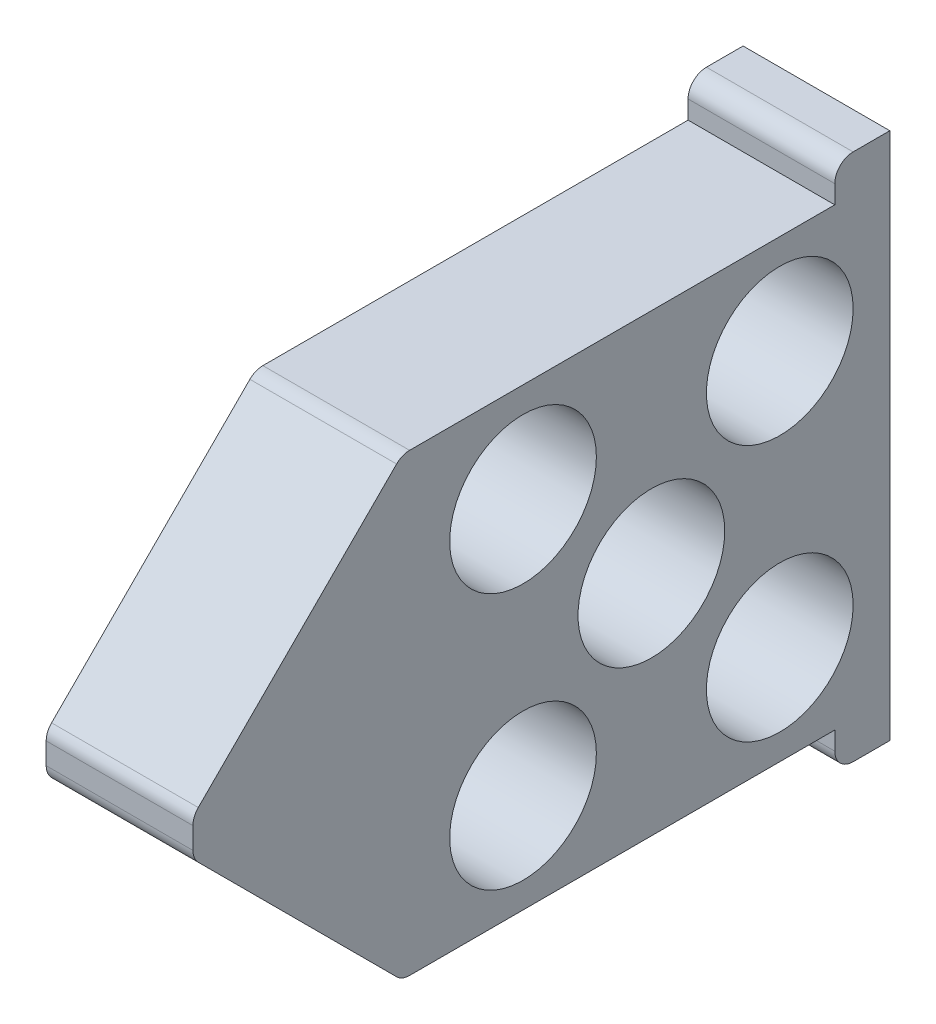
ISO-10303-21;
HEADER;
FILE_DESCRIPTION(('STEP AP214'),'2;1');
FILE_NAME('part.step','',(''),(''),'','','');
FILE_SCHEMA(('AUTOMOTIVE_DESIGN { 1 0 10303 214 1 1 1 1 }'));
ENDSEC;
DATA;
#1=APPLICATION_CONTEXT('core data for automotive mechanical design processes');
#2=APPLICATION_PROTOCOL_DEFINITION('international standard','automotive_design',2000,#1);
#3=PRODUCT_CONTEXT('',#1,'mechanical');
#4=PRODUCT('Part','Part','',(#3));
#5=PRODUCT_RELATED_PRODUCT_CATEGORY('part','',(#4));
#6=PRODUCT_DEFINITION_FORMATION('','',#4);
#7=PRODUCT_DEFINITION_CONTEXT('part definition',#1,'design');
#8=PRODUCT_DEFINITION('design','',#6,#7);
#9=PRODUCT_DEFINITION_SHAPE('','',#8);
#10=(LENGTH_UNIT() NAMED_UNIT(*) SI_UNIT(.MILLI.,.METRE.));
#11=(NAMED_UNIT(*) PLANE_ANGLE_UNIT() SI_UNIT($,.RADIAN.));
#12=(NAMED_UNIT(*) SI_UNIT($,.STERADIAN.) SOLID_ANGLE_UNIT());
#13=UNCERTAINTY_MEASURE_WITH_UNIT(LENGTH_MEASURE(1.E-05),#10,'distance_accuracy_value','');
#14=(GEOMETRIC_REPRESENTATION_CONTEXT(3) GLOBAL_UNCERTAINTY_ASSIGNED_CONTEXT((#13)) GLOBAL_UNIT_ASSIGNED_CONTEXT((#10,
#11,#12)) REPRESENTATION_CONTEXT('',''));
#15=CARTESIAN_POINT('',(0.,0.,0.));
#16=DIRECTION('',(0.,0.,1.));
#17=DIRECTION('',(1.,0.,0.));
#18=AXIS2_PLACEMENT_3D('',#15,#16,#17);
#19=CARTESIAN_POINT('',(4.,-6.20000000000003,-6.));
#20=DIRECTION('',(0.,1.,0.));
#21=DIRECTION('',(0.,0.,1.));
#22=AXIS2_PLACEMENT_3D('',#19,#20,#21);
#23=PLANE('',#22);
#24=DIRECTION('',(0.,0.,-1.));
#25=VECTOR('',#24,1.);
#26=CARTESIAN_POINT('',(4.,-6.20000000000003,-6.));
#27=LINE('',#26,#25);
#28=CARTESIAN_POINT('',(4.,-6.20000000000003,5.59289321881345));
#29=VERTEX_POINT('',#28);
#30=CARTESIAN_POINT('',(4.,-6.20000000000003,-6.));
#31=VERTEX_POINT('',#30);
#32=EDGE_CURVE('E150',#29,#31,#27,.T.);
#33=ORIENTED_EDGE('',*,*,#32,.F.);
#34=DIRECTION('',(-1.,0.,0.));
#35=VECTOR('',#34,1.);
#36=CARTESIAN_POINT('',(4.,-6.20000000000003,5.59289321881345));
#37=LINE('',#36,#35);
#38=CARTESIAN_POINT('',(0.,-6.20000000000003,5.59289321881345));
#39=VERTEX_POINT('',#38);
#40=EDGE_CURVE('E176',#29,#39,#37,.T.);
#41=ORIENTED_EDGE('',*,*,#40,.T.);
#42=DIRECTION('',(0.,0.,-1.));
#43=VECTOR('',#42,1.);
#44=CARTESIAN_POINT('',(0.,-6.20000000000003,-6.));
#45=LINE('',#44,#43);
#46=CARTESIAN_POINT('',(0.,-6.20000000000003,-6.));
#47=VERTEX_POINT('',#46);
#48=EDGE_CURVE('E174',#39,#47,#45,.T.);
#49=ORIENTED_EDGE('',*,*,#48,.T.);
#50=DIRECTION('',(-1.,0.,0.));
#51=VECTOR('',#50,1.);
#52=CARTESIAN_POINT('',(4.,-6.20000000000003,-6.));
#53=LINE('',#52,#51);
#54=EDGE_CURVE('E168',#31,#47,#53,.T.);
#55=ORIENTED_EDGE('',*,*,#54,.F.);
#56=EDGE_LOOP('',(#33,#41,#49,#55));
#57=FACE_BOUND('',#56,.T.);
#58=ADVANCED_FACE('F36',(#57),#23,.F.);
#59=CARTESIAN_POINT('',(4.,-6.20000000000003,-6.));
#60=DIRECTION('',(0.,0.,-1.));
#61=DIRECTION('',(0.,1.,0.));
#62=AXIS2_PLACEMENT_3D('',#59,#60,#61);
#63=PLANE('',#62);
#64=DIRECTION('',(0.,-1.,0.));
#65=VECTOR('',#64,1.);
#66=CARTESIAN_POINT('',(0.,-6.20000000000003,-6.));
#67=LINE('',#66,#65);
#68=CARTESIAN_POINT('',(0.,-6.70000000000003,-6.));
#69=VERTEX_POINT('',#68);
#70=EDGE_CURVE('E275',#47,#69,#67,.T.);
#71=ORIENTED_EDGE('',*,*,#70,.T.);
#72=DIRECTION('',(-1.,0.,0.));
#73=VECTOR('',#72,1.);
#74=CARTESIAN_POINT('',(4.,-6.70000000000003,-6.));
#75=LINE('',#74,#73);
#76=CARTESIAN_POINT('',(4.,-6.70000000000003,-6.));
#77=VERTEX_POINT('',#76);
#78=EDGE_CURVE('E170',#69,#77,#75,.F.);
#79=ORIENTED_EDGE('',*,*,#78,.T.);
#80=DIRECTION('',(0.,-1.,0.));
#81=VECTOR('',#80,1.);
#82=CARTESIAN_POINT('',(4.,-6.20000000000003,-6.));
#83=LINE('',#82,#81);
#84=EDGE_CURVE('E154',#31,#77,#83,.T.);
#85=ORIENTED_EDGE('',*,*,#84,.F.);
#86=ORIENTED_EDGE('',*,*,#54,.T.);
#87=EDGE_LOOP('',(#71,#79,#85,#86));
#88=FACE_BOUND('',#87,.T.);
#89=ADVANCED_FACE('F167',(#88),#63,.F.);
#90=CARTESIAN_POINT('',(4.,-7.20000000000003,-6.));
#91=DIRECTION('',(0.,1.,0.));
#92=DIRECTION('',(0.,0.,1.));
#93=AXIS2_PLACEMENT_3D('',#90,#91,#92);
#94=PLANE('',#93);
#95=DIRECTION('',(0.,0.,-1.));
#96=VECTOR('',#95,1.);
#97=CARTESIAN_POINT('',(4.,-7.20000000000003,-6.));
#98=LINE('',#97,#96);
#99=CARTESIAN_POINT('',(4.,-7.20000000000003,-6.5));
#100=VERTEX_POINT('',#99);
#101=CARTESIAN_POINT('',(4.,-7.20000000000003,-7.5));
#102=VERTEX_POINT('',#101);
#103=EDGE_CURVE('E171',#100,#102,#98,.T.);
#104=ORIENTED_EDGE('',*,*,#103,.F.);
#105=DIRECTION('',(-1.,0.,0.));
#106=VECTOR('',#105,1.);
#107=CARTESIAN_POINT('',(4.,-7.20000000000003,-6.5));
#108=LINE('',#107,#106);
#109=CARTESIAN_POINT('',(0.,-7.20000000000003,-6.5));
#110=VERTEX_POINT('',#109);
#111=EDGE_CURVE('E223',#100,#110,#108,.T.);
#112=ORIENTED_EDGE('',*,*,#111,.T.);
#113=DIRECTION('',(0.,0.,-1.));
#114=VECTOR('',#113,1.);
#115=CARTESIAN_POINT('',(0.,-7.20000000000003,-6.));
#116=LINE('',#115,#114);
#117=CARTESIAN_POINT('',(0.,-7.20000000000003,-7.5));
#118=VERTEX_POINT('',#117);
#119=EDGE_CURVE('E274',#110,#118,#116,.T.);
#120=ORIENTED_EDGE('',*,*,#119,.T.);
#121=DIRECTION('',(-1.,0.,0.));
#122=VECTOR('',#121,1.);
#123=CARTESIAN_POINT('',(4.,-7.20000000000003,-7.5));
#124=LINE('',#123,#122);
#125=EDGE_CURVE('E177',#102,#118,#124,.T.);
#126=ORIENTED_EDGE('',*,*,#125,.F.);
#127=EDGE_LOOP('',(#104,#112,#120,#126));
#128=FACE_BOUND('',#127,.T.);
#129=ADVANCED_FACE('F360',(#128),#94,.F.);
#130=CARTESIAN_POINT('',(4.,7.20000000000003,-7.5));
#131=DIRECTION('',(0.,0.,1.));
#132=DIRECTION('',(1.,0.,0.));
#133=AXIS2_PLACEMENT_3D('',#130,#131,#132);
#134=PLANE('',#133);
#135=DIRECTION('',(0.,1.,0.));
#136=VECTOR('',#135,1.);
#137=CARTESIAN_POINT('',(0.,7.20000000000003,-7.5));
#138=LINE('',#137,#136);
#139=CARTESIAN_POINT('',(0.,7.20000000000003,-7.5));
#140=VERTEX_POINT('',#139);
#141=EDGE_CURVE('E250',#118,#140,#138,.T.);
#142=ORIENTED_EDGE('',*,*,#141,.T.);
#143=DIRECTION('',(-1.,0.,0.));
#144=VECTOR('',#143,1.);
#145=CARTESIAN_POINT('',(4.,7.20000000000003,-7.5));
#146=LINE('',#145,#144);
#147=CARTESIAN_POINT('',(4.,7.20000000000003,-7.5));
#148=VERTEX_POINT('',#147);
#149=EDGE_CURVE('E182',#148,#140,#146,.T.);
#150=ORIENTED_EDGE('',*,*,#149,.F.);
#151=DIRECTION('',(0.,1.,0.));
#152=VECTOR('',#151,1.);
#153=CARTESIAN_POINT('',(4.,7.20000000000003,-7.5));
#154=LINE('',#153,#152);
#155=EDGE_CURVE('E291',#102,#148,#154,.T.);
#156=ORIENTED_EDGE('',*,*,#155,.F.);
#157=ORIENTED_EDGE('',*,*,#125,.T.);
#158=EDGE_LOOP('',(#142,#150,#156,#157));
#159=FACE_BOUND('',#158,.T.);
#160=ADVANCED_FACE('F384',(#159),#134,.F.);
#161=CARTESIAN_POINT('',(4.,7.20000000000003,-6.));
#162=DIRECTION('',(0.,-1.,0.));
#163=DIRECTION('',(0.,0.,-1.));
#164=AXIS2_PLACEMENT_3D('',#161,#162,#163);
#165=PLANE('',#164);
#166=DIRECTION('',(0.,0.,1.));
#167=VECTOR('',#166,1.);
#168=CARTESIAN_POINT('',(0.,7.20000000000003,-6.));
#169=LINE('',#168,#167);
#170=CARTESIAN_POINT('',(0.,7.20000000000003,-6.5));
#171=VERTEX_POINT('',#170);
#172=EDGE_CURVE('E246',#140,#171,#169,.T.);
#173=ORIENTED_EDGE('',*,*,#172,.T.);
#174=DIRECTION('',(-1.,0.,0.));
#175=VECTOR('',#174,1.);
#176=CARTESIAN_POINT('',(4.,7.20000000000003,-6.5));
#177=LINE('',#176,#175);
#178=CARTESIAN_POINT('',(4.,7.20000000000003,-6.5));
#179=VERTEX_POINT('',#178);
#180=EDGE_CURVE('E11',#171,#179,#177,.F.);
#181=ORIENTED_EDGE('',*,*,#180,.T.);
#182=DIRECTION('',(0.,0.,1.));
#183=VECTOR('',#182,1.);
#184=CARTESIAN_POINT('',(4.,7.20000000000003,-6.));
#185=LINE('',#184,#183);
#186=EDGE_CURVE('E269',#148,#179,#185,.T.);
#187=ORIENTED_EDGE('',*,*,#186,.F.);
#188=ORIENTED_EDGE('',*,*,#149,.T.);
#189=EDGE_LOOP('',(#173,#181,#187,#188));
#190=FACE_BOUND('',#189,.T.);
#191=ADVANCED_FACE('F266',(#190),#165,.F.);
#192=CARTESIAN_POINT('',(4.,6.20000000000003,-6.));
#193=DIRECTION('',(0.,0.,-1.));
#194=DIRECTION('',(0.,1.,0.));
#195=AXIS2_PLACEMENT_3D('',#192,#193,#194);
#196=PLANE('',#195);
#197=DIRECTION('',(0.,-1.,0.));
#198=VECTOR('',#197,1.);
#199=CARTESIAN_POINT('',(4.,6.20000000000003,-6.));
#200=LINE('',#199,#198);
#201=CARTESIAN_POINT('',(4.,6.70000000000003,-6.));
#202=VERTEX_POINT('',#201);
#203=CARTESIAN_POINT('',(4.,6.20000000000003,-6.));
#204=VERTEX_POINT('',#203);
#205=EDGE_CURVE('E236',#202,#204,#200,.T.);
#206=ORIENTED_EDGE('',*,*,#205,.F.);
#207=DIRECTION('',(-1.,0.,0.));
#208=VECTOR('',#207,1.);
#209=CARTESIAN_POINT('',(4.,6.70000000000003,-6.));
#210=LINE('',#209,#208);
#211=CARTESIAN_POINT('',(0.,6.70000000000003,-6.));
#212=VERTEX_POINT('',#211);
#213=EDGE_CURVE('E45',#202,#212,#210,.T.);
#214=ORIENTED_EDGE('',*,*,#213,.T.);
#215=DIRECTION('',(0.,-1.,0.));
#216=VECTOR('',#215,1.);
#217=CARTESIAN_POINT('',(0.,6.20000000000003,-6.));
#218=LINE('',#217,#216);
#219=CARTESIAN_POINT('',(0.,6.20000000000003,-6.));
#220=VERTEX_POINT('',#219);
#221=EDGE_CURVE('E234',#212,#220,#218,.T.);
#222=ORIENTED_EDGE('',*,*,#221,.T.);
#223=DIRECTION('',(-1.,0.,0.));
#224=VECTOR('',#223,1.);
#225=CARTESIAN_POINT('',(4.,6.20000000000003,-6.));
#226=LINE('',#225,#224);
#227=EDGE_CURVE('E260',#204,#220,#226,.T.);
#228=ORIENTED_EDGE('',*,*,#227,.F.);
#229=EDGE_LOOP('',(#206,#214,#222,#228));
#230=FACE_BOUND('',#229,.T.);
#231=ADVANCED_FACE('F232',(#230),#196,.F.);
#232=CARTESIAN_POINT('',(4.,6.20000000000003,-6.));
#233=DIRECTION('',(0.,-1.,0.));
#234=DIRECTION('',(0.,0.,-1.));
#235=AXIS2_PLACEMENT_3D('',#232,#233,#234);
#236=PLANE('',#235);
#237=DIRECTION('',(0.,0.,1.));
#238=VECTOR('',#237,1.);
#239=CARTESIAN_POINT('',(0.,6.20000000000003,-6.));
#240=LINE('',#239,#238);
#241=CARTESIAN_POINT('',(0.,6.20000000000003,5.59289321881345));
#242=VERTEX_POINT('',#241);
#243=EDGE_CURVE('E245',#220,#242,#240,.T.);
#244=ORIENTED_EDGE('',*,*,#243,.T.);
#245=DIRECTION('',(-1.,0.,0.));
#246=VECTOR('',#245,1.);
#247=CARTESIAN_POINT('',(4.,6.20000000000003,5.59289321881345));
#248=LINE('',#247,#246);
#249=CARTESIAN_POINT('',(4.,6.20000000000003,5.59289321881345));
#250=VERTEX_POINT('',#249);
#251=EDGE_CURVE('E221',#242,#250,#248,.F.);
#252=ORIENTED_EDGE('',*,*,#251,.T.);
#253=DIRECTION('',(0.,0.,1.));
#254=VECTOR('',#253,1.);
#255=CARTESIAN_POINT('',(4.,6.20000000000003,-6.));
#256=LINE('',#255,#254);
#257=EDGE_CURVE('E286',#204,#250,#256,.T.);
#258=ORIENTED_EDGE('',*,*,#257,.F.);
#259=ORIENTED_EDGE('',*,*,#227,.T.);
#260=EDGE_LOOP('',(#244,#252,#258,#259));
#261=FACE_BOUND('',#260,.T.);
#262=ADVANCED_FACE('F388',(#261),#236,.F.);
#263=CARTESIAN_POINT('',(4.,6.20000000000003,5.8));
#264=DIRECTION('',(0.,-0.707106781186546,-0.707106781186549));
#265=DIRECTION('',(0.,0.707106781186549,-0.707106781186546));
#266=AXIS2_PLACEMENT_3D('',#263,#264,#265);
#267=PLANE('',#266);
#268=DIRECTION('',(0.,-0.707106781186549,0.707106781186546));
#269=VECTOR('',#268,1.);
#270=CARTESIAN_POINT('',(0.,6.20000000000003,5.8));
#271=LINE('',#270,#269);
#272=CARTESIAN_POINT('',(0.,6.0535533905933,5.94644660940673));
#273=VERTEX_POINT('',#272);
#274=CARTESIAN_POINT('',(0.,0.646446609406727,11.3535533905933));
#275=VERTEX_POINT('',#274);
#276=EDGE_CURVE('E248',#273,#275,#271,.T.);
#277=ORIENTED_EDGE('',*,*,#276,.T.);
#278=DIRECTION('',(-1.,0.,0.));
#279=VECTOR('',#278,1.);
#280=CARTESIAN_POINT('',(4.,0.646446609406727,11.3535533905933));
#281=LINE('',#280,#279);
#282=CARTESIAN_POINT('',(4.,0.646446609406727,11.3535533905933));
#283=VERTEX_POINT('',#282);
#284=EDGE_CURVE('E219',#275,#283,#281,.F.);
#285=ORIENTED_EDGE('',*,*,#284,.T.);
#286=DIRECTION('',(0.,-0.707106781186549,0.707106781186546));
#287=VECTOR('',#286,1.);
#288=CARTESIAN_POINT('',(4.,6.20000000000003,5.8));
#289=LINE('',#288,#287);
#290=CARTESIAN_POINT('',(4.,6.0535533905933,5.94644660940673));
#291=VERTEX_POINT('',#290);
#292=EDGE_CURVE('E284',#291,#283,#289,.T.);
#293=ORIENTED_EDGE('',*,*,#292,.F.);
#294=DIRECTION('',(-1.,0.,0.));
#295=VECTOR('',#294,1.);
#296=CARTESIAN_POINT('',(4.,6.0535533905933,5.94644660940673));
#297=LINE('',#296,#295);
#298=EDGE_CURVE('E216',#291,#273,#297,.T.);
#299=ORIENTED_EDGE('',*,*,#298,.T.);
#300=EDGE_LOOP('',(#277,#285,#293,#299));
#301=FACE_BOUND('',#300,.T.);
#302=ADVANCED_FACE('F393',(#301),#267,.F.);
#303=CARTESIAN_POINT('',(4.,0.5,11.5));
#304=DIRECTION('',(0.,0.,-1.));
#305=DIRECTION('',(-1.,0.,0.));
#306=AXIS2_PLACEMENT_3D('',#303,#304,#305);
#307=PLANE('',#306);
#308=DIRECTION('',(0.,-1.,0.));
#309=VECTOR('',#308,1.);
#310=CARTESIAN_POINT('',(0.,0.5,11.5));
#311=LINE('',#310,#309);
#312=CARTESIAN_POINT('',(0.,0.292893218813454,11.5));
#313=VERTEX_POINT('',#312);
#314=CARTESIAN_POINT('',(0.,-0.292893218813454,11.5));
#315=VERTEX_POINT('',#314);
#316=EDGE_CURVE('E256',#313,#315,#311,.T.);
#317=ORIENTED_EDGE('',*,*,#316,.T.);
#318=DIRECTION('',(-1.,0.,0.));
#319=VECTOR('',#318,1.);
#320=CARTESIAN_POINT('',(4.,-0.292893218813454,11.5));
#321=LINE('',#320,#319);
#322=CARTESIAN_POINT('',(4.,-0.292893218813454,11.5));
#323=VERTEX_POINT('',#322);
#324=EDGE_CURVE('E52',#315,#323,#321,.F.);
#325=ORIENTED_EDGE('',*,*,#324,.T.);
#326=DIRECTION('',(0.,-1.,0.));
#327=VECTOR('',#326,1.);
#328=CARTESIAN_POINT('',(4.,0.5,11.5));
#329=LINE('',#328,#327);
#330=CARTESIAN_POINT('',(4.,0.292893218813454,11.5));
#331=VERTEX_POINT('',#330);
#332=EDGE_CURVE('E282',#331,#323,#329,.T.);
#333=ORIENTED_EDGE('',*,*,#332,.F.);
#334=DIRECTION('',(-1.,0.,0.));
#335=VECTOR('',#334,1.);
#336=CARTESIAN_POINT('',(4.,0.292893218813454,11.5));
#337=LINE('',#336,#335);
#338=EDGE_CURVE('E212',#331,#313,#337,.T.);
#339=ORIENTED_EDGE('',*,*,#338,.T.);
#340=EDGE_LOOP('',(#317,#325,#333,#339));
#341=FACE_BOUND('',#340,.T.);
#342=ADVANCED_FACE('F398',(#341),#307,.F.);
#343=CARTESIAN_POINT('',(4.,-6.20000000000003,5.8));
#344=DIRECTION('',(0.,0.707106781186546,-0.707106781186549));
#345=DIRECTION('',(0.,0.707106781186549,0.707106781186546));
#346=AXIS2_PLACEMENT_3D('',#343,#344,#345);
#347=PLANE('',#346);
#348=DIRECTION('',(0.,-0.707106781186549,-0.707106781186546));
#349=VECTOR('',#348,1.);
#350=CARTESIAN_POINT('',(0.,-6.20000000000003,5.8));
#351=LINE('',#350,#349);
#352=CARTESIAN_POINT('',(0.,-0.646446609406727,11.3535533905933));
#353=VERTEX_POINT('',#352);
#354=CARTESIAN_POINT('',(0.,-6.0535533905933,5.94644660940673));
#355=VERTEX_POINT('',#354);
#356=EDGE_CURVE('E162',#353,#355,#351,.T.);
#357=ORIENTED_EDGE('',*,*,#356,.T.);
#358=DIRECTION('',(-1.,0.,0.));
#359=VECTOR('',#358,1.);
#360=CARTESIAN_POINT('',(4.,-6.0535533905933,5.94644660940673));
#361=LINE('',#360,#359);
#362=CARTESIAN_POINT('',(4.,-6.0535533905933,5.94644660940673));
#363=VERTEX_POINT('',#362);
#364=EDGE_CURVE('E200',#355,#363,#361,.F.);
#365=ORIENTED_EDGE('',*,*,#364,.T.);
#366=DIRECTION('',(0.,-0.707106781186549,-0.707106781186546));
#367=VECTOR('',#366,1.);
#368=CARTESIAN_POINT('',(4.,-6.20000000000003,5.8));
#369=LINE('',#368,#367);
#370=CARTESIAN_POINT('',(4.,-0.646446609406727,11.3535533905933));
#371=VERTEX_POINT('',#370);
#372=EDGE_CURVE('E261',#371,#363,#369,.T.);
#373=ORIENTED_EDGE('',*,*,#372,.F.);
#374=DIRECTION('',(-1.,0.,0.));
#375=VECTOR('',#374,1.);
#376=CARTESIAN_POINT('',(4.,-0.646446609406727,11.3535533905933));
#377=LINE('',#376,#375);
#378=EDGE_CURVE('E197',#371,#353,#377,.T.);
#379=ORIENTED_EDGE('',*,*,#378,.T.);
#380=EDGE_LOOP('',(#357,#365,#373,#379));
#381=FACE_BOUND('',#380,.T.);
#382=ADVANCED_FACE('F326',(#381),#347,.F.);
#383=CARTESIAN_POINT('',(4.,0.,0.));
#384=DIRECTION('',(1.,0.,0.));
#385=DIRECTION('',(0.,0.,-1.));
#386=AXIS2_PLACEMENT_3D('',#383,#384,#385);
#387=PLANE('',#386);
#388=CARTESIAN_POINT('',(4.,-3.5,-4.5));
#389=DIRECTION('',(1.,0.,0.));
#390=DIRECTION('',(0.,0.,-1.));
#391=AXIS2_PLACEMENT_3D('',#388,#389,#390);
#392=CIRCLE('',#391,2.);
#393=CARTESIAN_POINT('',(4.,-3.5,-6.5));
#394=VERTEX_POINT('',#393);
#395=EDGE_CURVE('E317',#394,#394,#392,.T.);
#396=ORIENTED_EDGE('',*,*,#395,.F.);
#397=EDGE_LOOP('',(#396));
#398=FACE_BOUND('',#397,.T.);
#399=CARTESIAN_POINT('',(4.,3.5,-4.5));
#400=DIRECTION('',(1.,0.,0.));
#401=DIRECTION('',(0.,0.,-1.));
#402=AXIS2_PLACEMENT_3D('',#399,#400,#401);
#403=CIRCLE('',#402,2.);
#404=CARTESIAN_POINT('',(4.,3.5,-6.5));
#405=VERTEX_POINT('',#404);
#406=EDGE_CURVE('E311',#405,#405,#403,.T.);
#407=ORIENTED_EDGE('',*,*,#406,.F.);
#408=EDGE_LOOP('',(#407));
#409=FACE_BOUND('',#408,.T.);
#410=CARTESIAN_POINT('',(4.,-3.5,2.5));
#411=DIRECTION('',(1.,0.,0.));
#412=DIRECTION('',(0.,0.,-1.));
#413=AXIS2_PLACEMENT_3D('',#410,#411,#412);
#414=CIRCLE('',#413,2.);
#415=CARTESIAN_POINT('',(4.,-3.5,0.5));
#416=VERTEX_POINT('',#415);
#417=EDGE_CURVE('E305',#416,#416,#414,.T.);
#418=ORIENTED_EDGE('',*,*,#417,.F.);
#419=EDGE_LOOP('',(#418));
#420=FACE_BOUND('',#419,.T.);
#421=CARTESIAN_POINT('',(4.,3.5,2.5));
#422=DIRECTION('',(1.,0.,0.));
#423=DIRECTION('',(0.,0.,-1.));
#424=AXIS2_PLACEMENT_3D('',#421,#422,#423);
#425=CIRCLE('',#424,2.);
#426=CARTESIAN_POINT('',(4.,3.5,0.500000000000001));
#427=VERTEX_POINT('',#426);
#428=EDGE_CURVE('E299',#427,#427,#425,.T.);
#429=ORIENTED_EDGE('',*,*,#428,.F.);
#430=EDGE_LOOP('',(#429));
#431=FACE_BOUND('',#430,.T.);
#432=CARTESIAN_POINT('',(4.,0.,-1.));
#433=DIRECTION('',(1.,0.,0.));
#434=DIRECTION('',(0.,0.,-1.));
#435=AXIS2_PLACEMENT_3D('',#432,#433,#434);
#436=CIRCLE('',#435,2.);
#437=CARTESIAN_POINT('',(4.,0.,-3.));
#438=VERTEX_POINT('',#437);
#439=EDGE_CURVE('E296',#438,#438,#436,.T.);
#440=ORIENTED_EDGE('',*,*,#439,.F.);
#441=EDGE_LOOP('',(#440));
#442=FACE_BOUND('',#441,.T.);
#443=ORIENTED_EDGE('',*,*,#372,.T.);
#444=CARTESIAN_POINT('',(4.,-5.70000000000002,5.59289321881345));
#445=DIRECTION('',(1.,0.,0.));
#446=DIRECTION('',(0.,0.,-1.));
#447=AXIS2_PLACEMENT_3D('',#444,#445,#446);
#448=CIRCLE('',#447,0.5);
#449=EDGE_CURVE('E157',#363,#29,#448,.T.);
#450=ORIENTED_EDGE('',*,*,#449,.T.);
#451=ORIENTED_EDGE('',*,*,#32,.T.);
#452=ORIENTED_EDGE('',*,*,#84,.T.);
#453=CARTESIAN_POINT('',(4.,-6.70000000000003,-6.5));
#454=DIRECTION('',(1.,0.,0.));
#455=DIRECTION('',(0.,0.,-1.));
#456=AXIS2_PLACEMENT_3D('',#453,#454,#455);
#457=CIRCLE('',#456,0.5);
#458=EDGE_CURVE('E204',#77,#100,#457,.T.);
#459=ORIENTED_EDGE('',*,*,#458,.T.);
#460=ORIENTED_EDGE('',*,*,#103,.T.);
#461=ORIENTED_EDGE('',*,*,#155,.T.);
#462=ORIENTED_EDGE('',*,*,#186,.T.);
#463=CARTESIAN_POINT('',(4.,6.70000000000003,-6.5));
#464=DIRECTION('',(1.,0.,0.));
#465=DIRECTION('',(0.,0.,-1.));
#466=AXIS2_PLACEMENT_3D('',#463,#464,#465);
#467=CIRCLE('',#466,0.5);
#468=EDGE_CURVE('E202',#179,#202,#467,.T.);
#469=ORIENTED_EDGE('',*,*,#468,.T.);
#470=ORIENTED_EDGE('',*,*,#205,.T.);
#471=ORIENTED_EDGE('',*,*,#257,.T.);
#472=CARTESIAN_POINT('',(4.,5.70000000000002,5.59289321881345));
#473=DIRECTION('',(1.,0.,0.));
#474=DIRECTION('',(0.,0.,-1.));
#475=AXIS2_PLACEMENT_3D('',#472,#473,#474);
#476=CIRCLE('',#475,0.5);
#477=EDGE_CURVE('E206',#250,#291,#476,.T.);
#478=ORIENTED_EDGE('',*,*,#477,.T.);
#479=ORIENTED_EDGE('',*,*,#292,.T.);
#480=CARTESIAN_POINT('',(4.,0.292893218813454,11.));
#481=DIRECTION('',(1.,0.,0.));
#482=DIRECTION('',(0.,0.,-1.));
#483=AXIS2_PLACEMENT_3D('',#480,#481,#482);
#484=CIRCLE('',#483,0.5);
#485=EDGE_CURVE('E59',#283,#331,#484,.T.);
#486=ORIENTED_EDGE('',*,*,#485,.T.);
#487=ORIENTED_EDGE('',*,*,#332,.T.);
#488=CARTESIAN_POINT('',(4.,-0.292893218813454,11.));
#489=DIRECTION('',(1.,0.,0.));
#490=DIRECTION('',(0.,0.,-1.));
#491=AXIS2_PLACEMENT_3D('',#488,#489,#490);
#492=CIRCLE('',#491,0.5);
#493=EDGE_CURVE('E209',#323,#371,#492,.T.);
#494=ORIENTED_EDGE('',*,*,#493,.T.);
#495=EDGE_LOOP('',(#443,#450,#451,#452,#459,#460,#461,#462,#469,#470,#471,#478,#479,#486,#487,#494));
#496=FACE_BOUND('',#495,.T.);
#497=ADVANCED_FACE('F153',(#398,#409,#420,#431,#442,#496),#387,.T.);
#498=CARTESIAN_POINT('',(0.,0.,0.));
#499=DIRECTION('',(1.,0.,0.));
#500=DIRECTION('',(0.,0.,-1.));
#501=AXIS2_PLACEMENT_3D('',#498,#499,#500);
#502=PLANE('',#501);
#503=CARTESIAN_POINT('',(0.,-3.5,-4.5));
#504=DIRECTION('',(1.,0.,0.));
#505=DIRECTION('',(0.,0.,-1.));
#506=AXIS2_PLACEMENT_3D('',#503,#504,#505);
#507=CIRCLE('',#506,2.);
#508=CARTESIAN_POINT('',(0.,-3.5,-6.5));
#509=VERTEX_POINT('',#508);
#510=EDGE_CURVE('E314',#509,#509,#507,.T.);
#511=ORIENTED_EDGE('',*,*,#510,.T.);
#512=EDGE_LOOP('',(#511));
#513=FACE_BOUND('',#512,.T.);
#514=CARTESIAN_POINT('',(0.,3.5,-4.5));
#515=DIRECTION('',(1.,0.,0.));
#516=DIRECTION('',(0.,0.,-1.));
#517=AXIS2_PLACEMENT_3D('',#514,#515,#516);
#518=CIRCLE('',#517,2.);
#519=CARTESIAN_POINT('',(0.,3.5,-6.5));
#520=VERTEX_POINT('',#519);
#521=EDGE_CURVE('E308',#520,#520,#518,.T.);
#522=ORIENTED_EDGE('',*,*,#521,.T.);
#523=EDGE_LOOP('',(#522));
#524=FACE_BOUND('',#523,.T.);
#525=CARTESIAN_POINT('',(0.,-3.5,2.5));
#526=DIRECTION('',(1.,0.,0.));
#527=DIRECTION('',(0.,0.,-1.));
#528=AXIS2_PLACEMENT_3D('',#525,#526,#527);
#529=CIRCLE('',#528,2.);
#530=CARTESIAN_POINT('',(0.,-3.5,0.500000000000001));
#531=VERTEX_POINT('',#530);
#532=EDGE_CURVE('E302',#531,#531,#529,.T.);
#533=ORIENTED_EDGE('',*,*,#532,.T.);
#534=EDGE_LOOP('',(#533));
#535=FACE_BOUND('',#534,.T.);
#536=CARTESIAN_POINT('',(0.,3.5,2.5));
#537=DIRECTION('',(1.,0.,0.));
#538=DIRECTION('',(0.,0.,-1.));
#539=AXIS2_PLACEMENT_3D('',#536,#537,#538);
#540=CIRCLE('',#539,2.);
#541=CARTESIAN_POINT('',(0.,3.5,0.500000000000001));
#542=VERTEX_POINT('',#541);
#543=EDGE_CURVE('E40',#542,#542,#540,.T.);
#544=ORIENTED_EDGE('',*,*,#543,.T.);
#545=EDGE_LOOP('',(#544));
#546=FACE_BOUND('',#545,.T.);
#547=CARTESIAN_POINT('',(0.,0.,-1.));
#548=DIRECTION('',(1.,0.,0.));
#549=DIRECTION('',(0.,0.,-1.));
#550=AXIS2_PLACEMENT_3D('',#547,#548,#549);
#551=CIRCLE('',#550,2.);
#552=CARTESIAN_POINT('',(0.,0.,-3.));
#553=VERTEX_POINT('',#552);
#554=EDGE_CURVE('E280',#553,#553,#551,.T.);
#555=ORIENTED_EDGE('',*,*,#554,.T.);
#556=EDGE_LOOP('',(#555));
#557=FACE_BOUND('',#556,.T.);
#558=ORIENTED_EDGE('',*,*,#48,.F.);
#559=CARTESIAN_POINT('',(0.,-5.70000000000002,5.59289321881345));
#560=DIRECTION('',(1.,0.,0.));
#561=DIRECTION('',(0.,0.,-1.));
#562=AXIS2_PLACEMENT_3D('',#559,#560,#561);
#563=CIRCLE('',#562,0.5);
#564=EDGE_CURVE('E195',#39,#355,#563,.F.);
#565=ORIENTED_EDGE('',*,*,#564,.T.);
#566=ORIENTED_EDGE('',*,*,#356,.F.);
#567=CARTESIAN_POINT('',(0.,-0.292893218813454,11.));
#568=DIRECTION('',(1.,0.,0.));
#569=DIRECTION('',(0.,0.,-1.));
#570=AXIS2_PLACEMENT_3D('',#567,#568,#569);
#571=CIRCLE('',#570,0.5);
#572=EDGE_CURVE('E193',#353,#315,#571,.F.);
#573=ORIENTED_EDGE('',*,*,#572,.T.);
#574=ORIENTED_EDGE('',*,*,#316,.F.);
#575=CARTESIAN_POINT('',(0.,0.292893218813454,11.));
#576=DIRECTION('',(1.,0.,0.));
#577=DIRECTION('',(0.,0.,-1.));
#578=AXIS2_PLACEMENT_3D('',#575,#576,#577);
#579=CIRCLE('',#578,0.5);
#580=EDGE_CURVE('E191',#313,#275,#579,.F.);
#581=ORIENTED_EDGE('',*,*,#580,.T.);
#582=ORIENTED_EDGE('',*,*,#276,.F.);
#583=CARTESIAN_POINT('',(0.,5.70000000000002,5.59289321881345));
#584=DIRECTION('',(1.,0.,0.));
#585=DIRECTION('',(0.,0.,-1.));
#586=AXIS2_PLACEMENT_3D('',#583,#584,#585);
#587=CIRCLE('',#586,0.5);
#588=EDGE_CURVE('E189',#273,#242,#587,.F.);
#589=ORIENTED_EDGE('',*,*,#588,.T.);
#590=ORIENTED_EDGE('',*,*,#243,.F.);
#591=ORIENTED_EDGE('',*,*,#221,.F.);
#592=CARTESIAN_POINT('',(0.,6.70000000000003,-6.5));
#593=DIRECTION('',(1.,0.,0.));
#594=DIRECTION('',(0.,0.,-1.));
#595=AXIS2_PLACEMENT_3D('',#592,#593,#594);
#596=CIRCLE('',#595,0.5);
#597=EDGE_CURVE('E179',#212,#171,#596,.F.);
#598=ORIENTED_EDGE('',*,*,#597,.T.);
#599=ORIENTED_EDGE('',*,*,#172,.F.);
#600=ORIENTED_EDGE('',*,*,#141,.F.);
#601=ORIENTED_EDGE('',*,*,#119,.F.);
#602=CARTESIAN_POINT('',(0.,-6.70000000000003,-6.5));
#603=DIRECTION('',(1.,0.,0.));
#604=DIRECTION('',(0.,0.,-1.));
#605=AXIS2_PLACEMENT_3D('',#602,#603,#604);
#606=CIRCLE('',#605,0.5);
#607=EDGE_CURVE('E187',#110,#69,#606,.F.);
#608=ORIENTED_EDGE('',*,*,#607,.T.);
#609=ORIENTED_EDGE('',*,*,#70,.F.);
#610=EDGE_LOOP('',(#558,#565,#566,#573,#574,#581,#582,#589,#590,#591,#598,#599,#600,#601,#608,#609));
#611=FACE_BOUND('',#610,.T.);
#612=ADVANCED_FACE('F241',(#513,#524,#535,#546,#557,#611),#502,.F.);
#613=CARTESIAN_POINT('',(4.,-5.70000000000002,5.59289321881345));
#614=DIRECTION('',(-1.,0.,0.));
#615=DIRECTION('',(0.,0.,1.));
#616=AXIS2_PLACEMENT_3D('',#613,#614,#615);
#617=CYLINDRICAL_SURFACE('',#616,0.5);
#618=ORIENTED_EDGE('',*,*,#449,.F.);
#619=ORIENTED_EDGE('',*,*,#364,.F.);
#620=ORIENTED_EDGE('',*,*,#564,.F.);
#621=ORIENTED_EDGE('',*,*,#40,.F.);
#622=EDGE_LOOP('',(#618,#619,#620,#621));
#623=FACE_BOUND('',#622,.T.);
#624=ADVANCED_FACE('F344',(#623),#617,.T.);
#625=CARTESIAN_POINT('',(4.,-0.292893218813454,11.));
#626=DIRECTION('',(-1.,0.,0.));
#627=DIRECTION('',(0.,0.,1.));
#628=AXIS2_PLACEMENT_3D('',#625,#626,#627);
#629=CYLINDRICAL_SURFACE('',#628,0.5);
#630=ORIENTED_EDGE('',*,*,#493,.F.);
#631=ORIENTED_EDGE('',*,*,#324,.F.);
#632=ORIENTED_EDGE('',*,*,#572,.F.);
#633=ORIENTED_EDGE('',*,*,#378,.F.);
#634=EDGE_LOOP('',(#630,#631,#632,#633));
#635=FACE_BOUND('',#634,.T.);
#636=ADVANCED_FACE('F350',(#635),#629,.T.);
#637=CARTESIAN_POINT('',(4.,0.292893218813454,11.));
#638=DIRECTION('',(-1.,0.,0.));
#639=DIRECTION('',(0.,0.,1.));
#640=AXIS2_PLACEMENT_3D('',#637,#638,#639);
#641=CYLINDRICAL_SURFACE('',#640,0.5);
#642=ORIENTED_EDGE('',*,*,#485,.F.);
#643=ORIENTED_EDGE('',*,*,#284,.F.);
#644=ORIENTED_EDGE('',*,*,#580,.F.);
#645=ORIENTED_EDGE('',*,*,#338,.F.);
#646=EDGE_LOOP('',(#642,#643,#644,#645));
#647=FACE_BOUND('',#646,.T.);
#648=ADVANCED_FACE('F366',(#647),#641,.T.);
#649=CARTESIAN_POINT('',(4.,5.70000000000002,5.59289321881345));
#650=DIRECTION('',(-1.,0.,0.));
#651=DIRECTION('',(0.,0.,1.));
#652=AXIS2_PLACEMENT_3D('',#649,#650,#651);
#653=CYLINDRICAL_SURFACE('',#652,0.5);
#654=ORIENTED_EDGE('',*,*,#477,.F.);
#655=ORIENTED_EDGE('',*,*,#251,.F.);
#656=ORIENTED_EDGE('',*,*,#588,.F.);
#657=ORIENTED_EDGE('',*,*,#298,.F.);
#658=EDGE_LOOP('',(#654,#655,#656,#657));
#659=FACE_BOUND('',#658,.T.);
#660=ADVANCED_FACE('F370',(#659),#653,.T.);
#661=CARTESIAN_POINT('',(4.,-6.70000000000003,-6.5));
#662=DIRECTION('',(-1.,0.,0.));
#663=DIRECTION('',(0.,0.,1.));
#664=AXIS2_PLACEMENT_3D('',#661,#662,#663);
#665=CYLINDRICAL_SURFACE('',#664,0.5);
#666=ORIENTED_EDGE('',*,*,#458,.F.);
#667=ORIENTED_EDGE('',*,*,#78,.F.);
#668=ORIENTED_EDGE('',*,*,#607,.F.);
#669=ORIENTED_EDGE('',*,*,#111,.F.);
#670=EDGE_LOOP('',(#666,#667,#668,#669));
#671=FACE_BOUND('',#670,.T.);
#672=ADVANCED_FACE('F373',(#671),#665,.T.);
#673=CARTESIAN_POINT('',(4.,6.70000000000003,-6.5));
#674=DIRECTION('',(-1.,0.,0.));
#675=DIRECTION('',(0.,0.,1.));
#676=AXIS2_PLACEMENT_3D('',#673,#674,#675);
#677=CYLINDRICAL_SURFACE('',#676,0.5);
#678=ORIENTED_EDGE('',*,*,#468,.F.);
#679=ORIENTED_EDGE('',*,*,#180,.F.);
#680=ORIENTED_EDGE('',*,*,#597,.F.);
#681=ORIENTED_EDGE('',*,*,#213,.F.);
#682=EDGE_LOOP('',(#678,#679,#680,#681));
#683=FACE_BOUND('',#682,.T.);
#684=ADVANCED_FACE('F38',(#683),#677,.T.);
#685=CARTESIAN_POINT('',(4.,0.,-1.));
#686=DIRECTION('',(1.,0.,0.));
#687=DIRECTION('',(0.,0.,-1.));
#688=AXIS2_PLACEMENT_3D('',#685,#686,#687);
#689=CYLINDRICAL_SURFACE('',#688,2.);
#690=ORIENTED_EDGE('',*,*,#439,.T.);
#691=EDGE_LOOP('',(#690));
#692=FACE_BOUND('',#691,.T.);
#693=ORIENTED_EDGE('',*,*,#554,.F.);
#694=EDGE_LOOP('',(#693));
#695=FACE_BOUND('',#694,.T.);
#696=ADVANCED_FACE('F336',(#692,#695),#689,.F.);
#697=CARTESIAN_POINT('',(4.,3.5,2.5));
#698=DIRECTION('',(1.,0.,0.));
#699=DIRECTION('',(0.,0.,-1.));
#700=AXIS2_PLACEMENT_3D('',#697,#698,#699);
#701=CYLINDRICAL_SURFACE('',#700,2.);
#702=ORIENTED_EDGE('',*,*,#428,.T.);
#703=EDGE_LOOP('',(#702));
#704=FACE_BOUND('',#703,.T.);
#705=ORIENTED_EDGE('',*,*,#543,.F.);
#706=EDGE_LOOP('',(#705));
#707=FACE_BOUND('',#706,.T.);
#708=ADVANCED_FACE('F339',(#704,#707),#701,.F.);
#709=CARTESIAN_POINT('',(4.,-3.5,2.5));
#710=DIRECTION('',(1.,0.,0.));
#711=DIRECTION('',(0.,0.,-1.));
#712=AXIS2_PLACEMENT_3D('',#709,#710,#711);
#713=CYLINDRICAL_SURFACE('',#712,2.);
#714=ORIENTED_EDGE('',*,*,#417,.T.);
#715=EDGE_LOOP('',(#714));
#716=FACE_BOUND('',#715,.T.);
#717=ORIENTED_EDGE('',*,*,#532,.F.);
#718=EDGE_LOOP('',(#717));
#719=FACE_BOUND('',#718,.T.);
#720=ADVANCED_FACE('F512',(#716,#719),#713,.F.);
#721=CARTESIAN_POINT('',(4.,3.5,-4.5));
#722=DIRECTION('',(1.,0.,0.));
#723=DIRECTION('',(0.,0.,-1.));
#724=AXIS2_PLACEMENT_3D('',#721,#722,#723);
#725=CYLINDRICAL_SURFACE('',#724,2.);
#726=ORIENTED_EDGE('',*,*,#406,.T.);
#727=EDGE_LOOP('',(#726));
#728=FACE_BOUND('',#727,.T.);
#729=ORIENTED_EDGE('',*,*,#521,.F.);
#730=EDGE_LOOP('',(#729));
#731=FACE_BOUND('',#730,.T.);
#732=ADVANCED_FACE('F522',(#728,#731),#725,.F.);
#733=CARTESIAN_POINT('',(4.,-3.5,-4.5));
#734=DIRECTION('',(1.,0.,0.));
#735=DIRECTION('',(0.,0.,-1.));
#736=AXIS2_PLACEMENT_3D('',#733,#734,#735);
#737=CYLINDRICAL_SURFACE('',#736,2.);
#738=ORIENTED_EDGE('',*,*,#395,.T.);
#739=EDGE_LOOP('',(#738));
#740=FACE_BOUND('',#739,.T.);
#741=ORIENTED_EDGE('',*,*,#510,.F.);
#742=EDGE_LOOP('',(#741));
#743=FACE_BOUND('',#742,.T.);
#744=ADVANCED_FACE('F321',(#740,#743),#737,.F.);
#745=CLOSED_SHELL('',(#58,#89,#129,#160,#191,#231,#262,#302,#342,#382,#497,#612,#624,#636,#648,
#660,#672,#684,#696,#708,#720,#732,#744));
#746=MANIFOLD_SOLID_BREP('B2',#745);
#747=ADVANCED_BREP_SHAPE_REPRESENTATION('',(#18,#746),#14);
#748=SHAPE_DEFINITION_REPRESENTATION(#9,#747);
ENDSEC;
END-ISO-10303-21;
